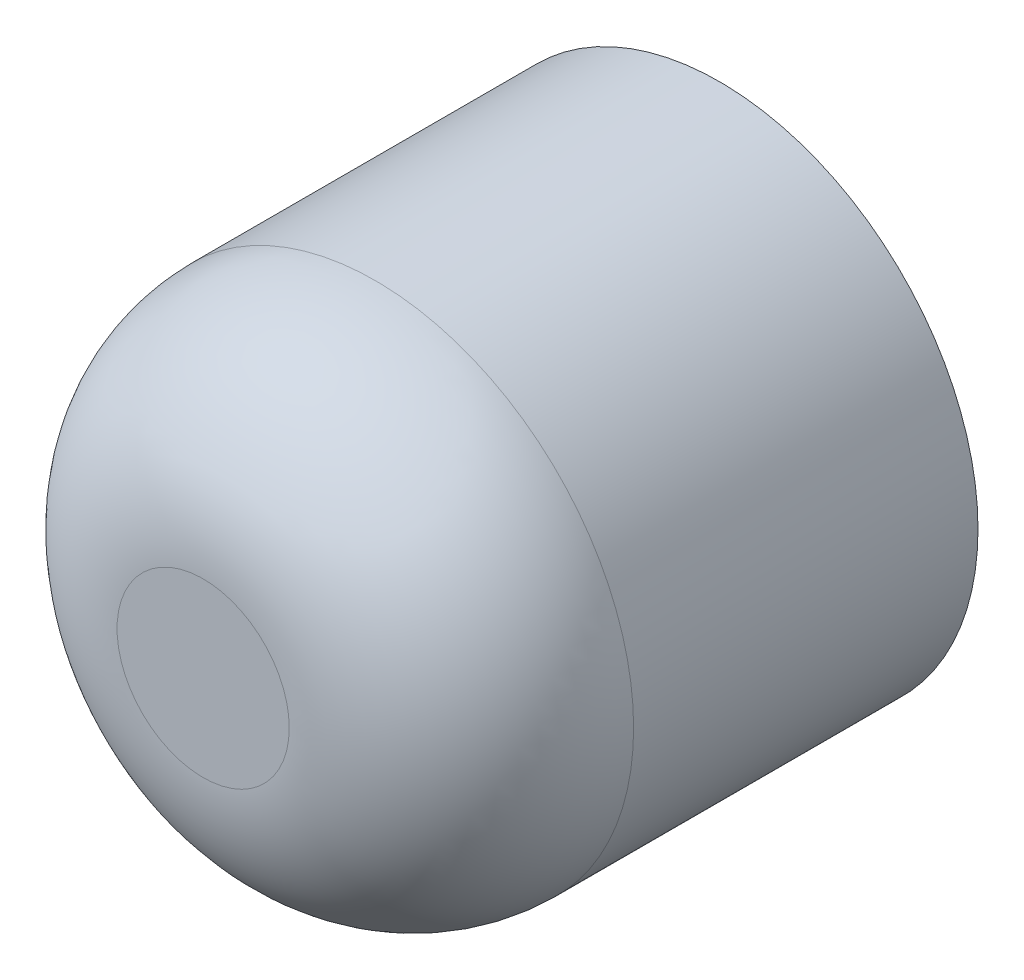
ISO-10303-21;
HEADER;
FILE_DESCRIPTION(('STEP AP214'),'2;1');
FILE_NAME('part.step','',(''),(''),'','','');
FILE_SCHEMA(('AUTOMOTIVE_DESIGN { 1 0 10303 214 1 1 1 1 }'));
ENDSEC;
DATA;
#1=APPLICATION_CONTEXT('core data for automotive mechanical design processes');
#2=APPLICATION_PROTOCOL_DEFINITION('international standard','automotive_design',2000,#1);
#3=PRODUCT_CONTEXT('',#1,'mechanical');
#4=PRODUCT('Part','Part','',(#3));
#5=PRODUCT_RELATED_PRODUCT_CATEGORY('part','',(#4));
#6=PRODUCT_DEFINITION_FORMATION('','',#4);
#7=PRODUCT_DEFINITION_CONTEXT('part definition',#1,'design');
#8=PRODUCT_DEFINITION('design','',#6,#7);
#9=PRODUCT_DEFINITION_SHAPE('','',#8);
#10=(LENGTH_UNIT() NAMED_UNIT(*) SI_UNIT(.MILLI.,.METRE.));
#11=(NAMED_UNIT(*) PLANE_ANGLE_UNIT() SI_UNIT($,.RADIAN.));
#12=(NAMED_UNIT(*) SI_UNIT($,.STERADIAN.) SOLID_ANGLE_UNIT());
#13=UNCERTAINTY_MEASURE_WITH_UNIT(LENGTH_MEASURE(1.E-05),#10,'distance_accuracy_value','');
#14=(GEOMETRIC_REPRESENTATION_CONTEXT(3) GLOBAL_UNCERTAINTY_ASSIGNED_CONTEXT((#13)) GLOBAL_UNIT_ASSIGNED_CONTEXT((#10,
#11,#12)) REPRESENTATION_CONTEXT('',''));
#15=CARTESIAN_POINT('',(0.,0.,0.));
#16=DIRECTION('',(0.,0.,1.));
#17=DIRECTION('',(1.,0.,0.));
#18=AXIS2_PLACEMENT_3D('',#15,#16,#17);
#19=CARTESIAN_POINT('',(0.,0.,3.));
#20=DIRECTION('',(0.,0.,-1.));
#21=DIRECTION('',(-1.,0.,0.));
#22=AXIS2_PLACEMENT_3D('',#19,#20,#21);
#23=CYLINDRICAL_SURFACE('',#22,1.5);
#24=CARTESIAN_POINT('',(0.,0.,2.));
#25=DIRECTION('',(0.,0.,1.));
#26=DIRECTION('',(1.,0.,0.));
#27=AXIS2_PLACEMENT_3D('',#24,#25,#26);
#28=CIRCLE('',#27,1.5);
#29=CARTESIAN_POINT('',(1.5,0.,2.));
#30=VERTEX_POINT('',#29);
#31=EDGE_CURVE('E11',#30,#30,#28,.F.);
#32=ORIENTED_EDGE('',*,*,#31,.T.);
#33=EDGE_LOOP('',(#32));
#34=FACE_BOUND('',#33,.T.);
#35=CARTESIAN_POINT('',(0.,0.,0.));
#36=DIRECTION('',(0.,0.,1.));
#37=DIRECTION('',(1.,0.,0.));
#38=AXIS2_PLACEMENT_3D('',#35,#36,#37);
#39=CIRCLE('',#38,1.5);
#40=CARTESIAN_POINT('',(1.5,0.,0.));
#41=VERTEX_POINT('',#40);
#42=EDGE_CURVE('E154',#41,#41,#39,.T.);
#43=ORIENTED_EDGE('',*,*,#42,.T.);
#44=EDGE_LOOP('',(#43));
#45=FACE_BOUND('',#44,.T.);
#46=ADVANCED_FACE('F39',(#34,#45),#23,.T.);
#47=CARTESIAN_POINT('',(0.,0.,3.));
#48=DIRECTION('',(0.,0.,1.));
#49=DIRECTION('',(1.,0.,0.));
#50=AXIS2_PLACEMENT_3D('',#47,#48,#49);
#51=PLANE('',#50);
#52=CARTESIAN_POINT('',(0.,0.,3.));
#53=DIRECTION('',(0.,0.,1.));
#54=DIRECTION('',(1.,0.,0.));
#55=AXIS2_PLACEMENT_3D('',#52,#53,#54);
#56=CIRCLE('',#55,0.5);
#57=CARTESIAN_POINT('',(0.5,0.,3.));
#58=VERTEX_POINT('',#57);
#59=EDGE_CURVE('E48',#58,#58,#56,.T.);
#60=ORIENTED_EDGE('',*,*,#59,.T.);
#61=EDGE_LOOP('',(#60));
#62=FACE_BOUND('',#61,.T.);
#63=ADVANCED_FACE('F170',(#62),#51,.T.);
#64=CARTESIAN_POINT('',(0.,0.,0.));
#65=DIRECTION('',(0.,0.,1.));
#66=DIRECTION('',(1.,0.,0.));
#67=AXIS2_PLACEMENT_3D('',#64,#65,#66);
#68=PLANE('',#67);
#69=DIRECTION('',(0.5,0.866025403784439,0.));
#70=VECTOR('',#69,1.);
#71=CARTESIAN_POINT('',(-0.866025403784439,0.,0.));
#72=LINE('',#71,#70);
#73=CARTESIAN_POINT('',(-0.866025403784439,0.,0.));
#74=VERTEX_POINT('',#73);
#75=CARTESIAN_POINT('',(-0.433012701892218,0.750000000000001,0.));
#76=VERTEX_POINT('',#75);
#77=EDGE_CURVE('E135',#74,#76,#72,.T.);
#78=ORIENTED_EDGE('',*,*,#77,.F.);
#79=DIRECTION('',(-0.5,0.866025403784439,0.));
#80=VECTOR('',#79,1.);
#81=CARTESIAN_POINT('',(-0.433012701892219,-0.750000000000001,0.));
#82=LINE('',#81,#80);
#83=CARTESIAN_POINT('',(-0.433012701892219,-0.750000000000001,0.));
#84=VERTEX_POINT('',#83);
#85=EDGE_CURVE('E55',#84,#74,#82,.T.);
#86=ORIENTED_EDGE('',*,*,#85,.F.);
#87=DIRECTION('',(-1.,0.,0.));
#88=VECTOR('',#87,1.);
#89=CARTESIAN_POINT('',(0.433012701892219,-0.750000000000001,0.));
#90=LINE('',#89,#88);
#91=CARTESIAN_POINT('',(0.433012701892219,-0.750000000000001,0.));
#92=VERTEX_POINT('',#91);
#93=EDGE_CURVE('E148',#92,#84,#90,.T.);
#94=ORIENTED_EDGE('',*,*,#93,.F.);
#95=DIRECTION('',(-0.5,-0.866025403784439,0.));
#96=VECTOR('',#95,1.);
#97=CARTESIAN_POINT('',(0.866025403784439,0.,0.));
#98=LINE('',#97,#96);
#99=CARTESIAN_POINT('',(0.866025403784439,0.,0.));
#100=VERTEX_POINT('',#99);
#101=EDGE_CURVE('E145',#100,#92,#98,.T.);
#102=ORIENTED_EDGE('',*,*,#101,.F.);
#103=DIRECTION('',(0.5,-0.866025403784438,0.));
#104=VECTOR('',#103,1.);
#105=CARTESIAN_POINT('',(0.433012701892219,0.750000000000001,0.));
#106=LINE('',#105,#104);
#107=CARTESIAN_POINT('',(0.433012701892219,0.750000000000001,0.));
#108=VERTEX_POINT('',#107);
#109=EDGE_CURVE('E103',#108,#100,#106,.T.);
#110=ORIENTED_EDGE('',*,*,#109,.F.);
#111=DIRECTION('',(1.,0.,0.));
#112=VECTOR('',#111,1.);
#113=CARTESIAN_POINT('',(-0.433012701892218,0.750000000000001,0.));
#114=LINE('',#113,#112);
#115=EDGE_CURVE('E139',#76,#108,#114,.T.);
#116=ORIENTED_EDGE('',*,*,#115,.F.);
#117=EDGE_LOOP('',(#78,#86,#94,#102,#110,#116));
#118=FACE_BOUND('',#117,.T.);
#119=ORIENTED_EDGE('',*,*,#42,.F.);
#120=EDGE_LOOP('',(#119));
#121=FACE_BOUND('',#120,.T.);
#122=ADVANCED_FACE('F174',(#118,#121),#68,.F.);
#123=CARTESIAN_POINT('',(0.,0.,2.));
#124=DIRECTION('',(0.,0.,1.));
#125=DIRECTION('',(1.,0.,0.));
#126=AXIS2_PLACEMENT_3D('',#123,#124,#125);
#127=DEGENERATE_TOROIDAL_SURFACE('',#126,0.5,1.,.T.);
#128=ORIENTED_EDGE('',*,*,#31,.F.);
#129=EDGE_LOOP('',(#128));
#130=FACE_BOUND('',#129,.T.);
#131=ORIENTED_EDGE('',*,*,#59,.F.);
#132=EDGE_LOOP('',(#131));
#133=FACE_BOUND('',#132,.T.);
#134=ADVANCED_FACE('F41',(#130,#133),#127,.T.);
#135=CARTESIAN_POINT('',(-0.433012701892219,-0.750000000000001,1.5));
#136=DIRECTION('',(-0.866025403784439,-0.5,0.));
#137=DIRECTION('',(0.5,-0.866025403784439,0.));
#138=AXIS2_PLACEMENT_3D('',#135,#136,#137);
#139=PLANE('',#138);
#140=ORIENTED_EDGE('',*,*,#85,.T.);
#141=DIRECTION('',(0.,0.,-1.));
#142=VECTOR('',#141,1.);
#143=CARTESIAN_POINT('',(-0.866025403784439,0.,1.5));
#144=LINE('',#143,#142);
#145=CARTESIAN_POINT('',(-0.866025403784439,0.,1.5));
#146=VERTEX_POINT('',#145);
#147=EDGE_CURVE('E85',#146,#74,#144,.T.);
#148=ORIENTED_EDGE('',*,*,#147,.F.);
#149=DIRECTION('',(-0.5,0.866025403784439,0.));
#150=VECTOR('',#149,1.);
#151=CARTESIAN_POINT('',(-0.433012701892219,-0.750000000000001,1.5));
#152=LINE('',#151,#150);
#153=CARTESIAN_POINT('',(-0.433012701892219,-0.750000000000001,1.5));
#154=VERTEX_POINT('',#153);
#155=EDGE_CURVE('E151',#154,#146,#152,.T.);
#156=ORIENTED_EDGE('',*,*,#155,.F.);
#157=DIRECTION('',(0.,0.,-1.));
#158=VECTOR('',#157,1.);
#159=CARTESIAN_POINT('',(-0.433012701892219,-0.750000000000001,1.5));
#160=LINE('',#159,#158);
#161=EDGE_CURVE('E63',#154,#84,#160,.T.);
#162=ORIENTED_EDGE('',*,*,#161,.T.);
#163=EDGE_LOOP('',(#140,#148,#156,#162));
#164=FACE_BOUND('',#163,.T.);
#165=ADVANCED_FACE('F173',(#164),#139,.F.);
#166=CARTESIAN_POINT('',(0.433012701892219,-0.750000000000001,1.5));
#167=DIRECTION('',(0.,-1.,0.));
#168=DIRECTION('',(1.,0.,0.));
#169=AXIS2_PLACEMENT_3D('',#166,#167,#168);
#170=PLANE('',#169);
#171=ORIENTED_EDGE('',*,*,#93,.T.);
#172=ORIENTED_EDGE('',*,*,#161,.F.);
#173=DIRECTION('',(-1.,0.,0.));
#174=VECTOR('',#173,1.);
#175=CARTESIAN_POINT('',(0.433012701892219,-0.750000000000001,1.5));
#176=LINE('',#175,#174);
#177=CARTESIAN_POINT('',(0.433012701892219,-0.750000000000001,1.5));
#178=VERTEX_POINT('',#177);
#179=EDGE_CURVE('E117',#178,#154,#176,.T.);
#180=ORIENTED_EDGE('',*,*,#179,.F.);
#181=DIRECTION('',(0.,0.,-1.));
#182=VECTOR('',#181,1.);
#183=CARTESIAN_POINT('',(0.433012701892219,-0.750000000000001,1.5));
#184=LINE('',#183,#182);
#185=EDGE_CURVE('E108',#178,#92,#184,.T.);
#186=ORIENTED_EDGE('',*,*,#185,.T.);
#187=EDGE_LOOP('',(#171,#172,#180,#186));
#188=FACE_BOUND('',#187,.T.);
#189=ADVANCED_FACE('F180',(#188),#170,.F.);
#190=CARTESIAN_POINT('',(0.866025403784439,0.,1.5));
#191=DIRECTION('',(0.866025403784439,-0.5,0.));
#192=DIRECTION('',(0.5,0.866025403784439,0.));
#193=AXIS2_PLACEMENT_3D('',#190,#191,#192);
#194=PLANE('',#193);
#195=ORIENTED_EDGE('',*,*,#101,.T.);
#196=ORIENTED_EDGE('',*,*,#185,.F.);
#197=DIRECTION('',(-0.5,-0.866025403784439,0.));
#198=VECTOR('',#197,1.);
#199=CARTESIAN_POINT('',(0.866025403784439,0.,1.5));
#200=LINE('',#199,#198);
#201=CARTESIAN_POINT('',(0.866025403784439,0.,1.5));
#202=VERTEX_POINT('',#201);
#203=EDGE_CURVE('E112',#202,#178,#200,.T.);
#204=ORIENTED_EDGE('',*,*,#203,.F.);
#205=DIRECTION('',(0.,0.,-1.));
#206=VECTOR('',#205,1.);
#207=CARTESIAN_POINT('',(0.866025403784439,0.,1.5));
#208=LINE('',#207,#206);
#209=EDGE_CURVE('E96',#202,#100,#208,.T.);
#210=ORIENTED_EDGE('',*,*,#209,.T.);
#211=EDGE_LOOP('',(#195,#196,#204,#210));
#212=FACE_BOUND('',#211,.T.);
#213=ADVANCED_FACE('F113',(#212),#194,.F.);
#214=CARTESIAN_POINT('',(0.433012701892219,0.750000000000001,1.5));
#215=DIRECTION('',(0.866025403784439,0.5,0.));
#216=DIRECTION('',(-0.5,0.866025403784439,0.));
#217=AXIS2_PLACEMENT_3D('',#214,#215,#216);
#218=PLANE('',#217);
#219=ORIENTED_EDGE('',*,*,#109,.T.);
#220=ORIENTED_EDGE('',*,*,#209,.F.);
#221=DIRECTION('',(0.5,-0.866025403784438,0.));
#222=VECTOR('',#221,1.);
#223=CARTESIAN_POINT('',(0.433012701892219,0.750000000000001,1.5));
#224=LINE('',#223,#222);
#225=CARTESIAN_POINT('',(0.433012701892219,0.750000000000001,1.5));
#226=VERTEX_POINT('',#225);
#227=EDGE_CURVE('E100',#226,#202,#224,.T.);
#228=ORIENTED_EDGE('',*,*,#227,.F.);
#229=DIRECTION('',(0.,0.,-1.));
#230=VECTOR('',#229,1.);
#231=CARTESIAN_POINT('',(0.433012701892219,0.750000000000001,1.5));
#232=LINE('',#231,#230);
#233=EDGE_CURVE('E109',#226,#108,#232,.T.);
#234=ORIENTED_EDGE('',*,*,#233,.T.);
#235=EDGE_LOOP('',(#219,#220,#228,#234));
#236=FACE_BOUND('',#235,.T.);
#237=ADVANCED_FACE('F98',(#236),#218,.F.);
#238=CARTESIAN_POINT('',(-0.433012701892218,0.750000000000001,1.5));
#239=DIRECTION('',(0.,1.,0.));
#240=DIRECTION('',(-1.,0.,0.));
#241=AXIS2_PLACEMENT_3D('',#238,#239,#240);
#242=PLANE('',#241);
#243=ORIENTED_EDGE('',*,*,#115,.T.);
#244=ORIENTED_EDGE('',*,*,#233,.F.);
#245=DIRECTION('',(1.,0.,0.));
#246=VECTOR('',#245,1.);
#247=CARTESIAN_POINT('',(-0.433012701892218,0.750000000000001,1.5));
#248=LINE('',#247,#246);
#249=CARTESIAN_POINT('',(-0.433012701892218,0.750000000000001,1.5));
#250=VERTEX_POINT('',#249);
#251=EDGE_CURVE('E123',#250,#226,#248,.T.);
#252=ORIENTED_EDGE('',*,*,#251,.F.);
#253=DIRECTION('',(0.,0.,-1.));
#254=VECTOR('',#253,1.);
#255=CARTESIAN_POINT('',(-0.433012701892218,0.750000000000001,1.5));
#256=LINE('',#255,#254);
#257=EDGE_CURVE('E159',#250,#76,#256,.T.);
#258=ORIENTED_EDGE('',*,*,#257,.T.);
#259=EDGE_LOOP('',(#243,#244,#252,#258));
#260=FACE_BOUND('',#259,.T.);
#261=ADVANCED_FACE('F196',(#260),#242,.F.);
#262=CARTESIAN_POINT('',(-0.866025403784439,0.,1.5));
#263=DIRECTION('',(-0.866025403784438,0.5,0.));
#264=DIRECTION('',(-0.5,-0.866025403784439,0.));
#265=AXIS2_PLACEMENT_3D('',#262,#263,#264);
#266=PLANE('',#265);
#267=ORIENTED_EDGE('',*,*,#77,.T.);
#268=ORIENTED_EDGE('',*,*,#257,.F.);
#269=DIRECTION('',(0.5,0.866025403784439,0.));
#270=VECTOR('',#269,1.);
#271=CARTESIAN_POINT('',(-0.866025403784439,0.,1.5));
#272=LINE('',#271,#270);
#273=EDGE_CURVE('E127',#146,#250,#272,.T.);
#274=ORIENTED_EDGE('',*,*,#273,.F.);
#275=ORIENTED_EDGE('',*,*,#147,.T.);
#276=EDGE_LOOP('',(#267,#268,#274,#275));
#277=FACE_BOUND('',#276,.T.);
#278=ADVANCED_FACE('F193',(#277),#266,.F.);
#279=CARTESIAN_POINT('',(0.,0.,1.5));
#280=DIRECTION('',(0.,0.,-1.));
#281=DIRECTION('',(-1.,0.,0.));
#282=AXIS2_PLACEMENT_3D('',#279,#280,#281);
#283=PLANE('',#282);
#284=ORIENTED_EDGE('',*,*,#155,.T.);
#285=ORIENTED_EDGE('',*,*,#273,.T.);
#286=ORIENTED_EDGE('',*,*,#251,.T.);
#287=ORIENTED_EDGE('',*,*,#227,.T.);
#288=ORIENTED_EDGE('',*,*,#203,.T.);
#289=ORIENTED_EDGE('',*,*,#179,.T.);
#290=EDGE_LOOP('',(#284,#285,#286,#287,#288,#289));
#291=FACE_BOUND('',#290,.T.);
#292=ADVANCED_FACE('F120',(#291),#283,.T.);
#293=CLOSED_SHELL('',(#46,#63,#122,#134,#165,#189,#213,#237,#261,#278,#292));
#294=MANIFOLD_SOLID_BREP('B2',#293);
#295=ADVANCED_BREP_SHAPE_REPRESENTATION('',(#18,#294),#14);
#296=SHAPE_DEFINITION_REPRESENTATION(#9,#295);
ENDSEC;
END-ISO-10303-21;
